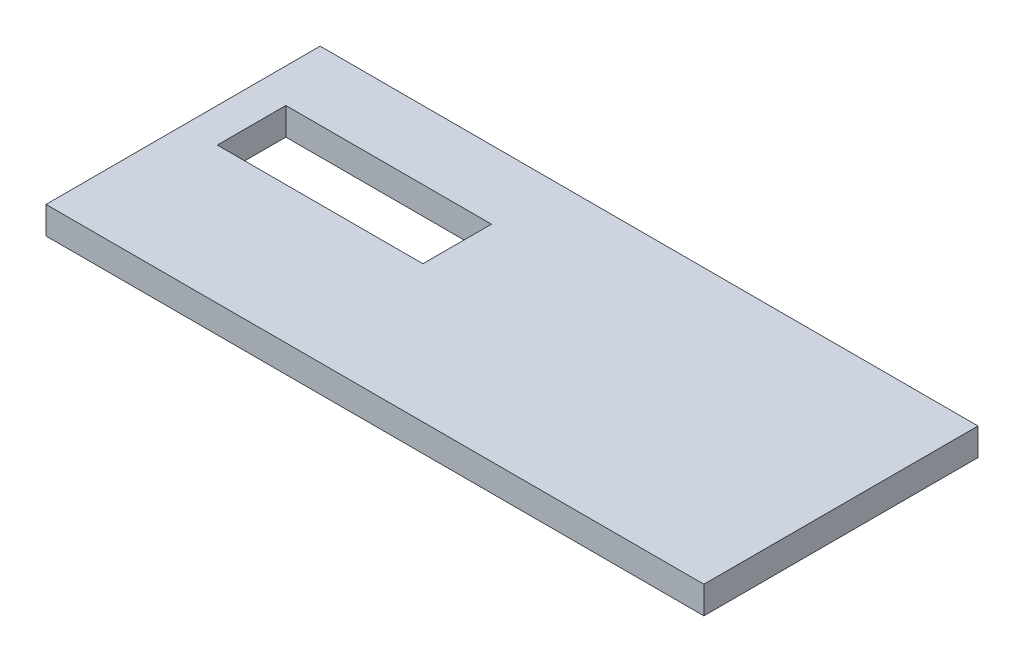
ISO-10303-21;
HEADER;
FILE_DESCRIPTION(('STEP AP214'),'2;1');
FILE_NAME('part.step','',(''),(''),'','','');
FILE_SCHEMA(('AUTOMOTIVE_DESIGN { 1 0 10303 214 1 1 1 1 }'));
ENDSEC;
DATA;
#1=APPLICATION_CONTEXT('core data for automotive mechanical design processes');
#2=APPLICATION_PROTOCOL_DEFINITION('international standard','automotive_design',2000,#1);
#3=PRODUCT_CONTEXT('',#1,'mechanical');
#4=PRODUCT('Part','Part','',(#3));
#5=PRODUCT_RELATED_PRODUCT_CATEGORY('part','',(#4));
#6=PRODUCT_DEFINITION_FORMATION('','',#4);
#7=PRODUCT_DEFINITION_CONTEXT('part definition',#1,'design');
#8=PRODUCT_DEFINITION('design','',#6,#7);
#9=PRODUCT_DEFINITION_SHAPE('','',#8);
#10=(LENGTH_UNIT() NAMED_UNIT(*) SI_UNIT(.MILLI.,.METRE.));
#11=(NAMED_UNIT(*) PLANE_ANGLE_UNIT() SI_UNIT($,.RADIAN.));
#12=(NAMED_UNIT(*) SI_UNIT($,.STERADIAN.) SOLID_ANGLE_UNIT());
#13=UNCERTAINTY_MEASURE_WITH_UNIT(LENGTH_MEASURE(1.E-05),#10,'distance_accuracy_value','');
#14=(GEOMETRIC_REPRESENTATION_CONTEXT(3) GLOBAL_UNCERTAINTY_ASSIGNED_CONTEXT((#13)) GLOBAL_UNIT_ASSIGNED_CONTEXT((#10,
#11,#12)) REPRESENTATION_CONTEXT('',''));
#15=CARTESIAN_POINT('',(0.,0.,0.));
#16=DIRECTION('',(0.,0.,1.));
#17=DIRECTION('',(1.,0.,0.));
#18=AXIS2_PLACEMENT_3D('',#15,#16,#17);
#19=CARTESIAN_POINT('',(0.,4.,0.));
#20=DIRECTION('',(0.,1.,0.));
#21=DIRECTION('',(0.,0.,1.));
#22=AXIS2_PLACEMENT_3D('',#19,#20,#21);
#23=PLANE('',#22);
#24=DIRECTION('',(0.,0.,1.));
#25=VECTOR('',#24,1.);
#26=CARTESIAN_POINT('',(0.,4.,0.));
#27=LINE('',#26,#25);
#28=CARTESIAN_POINT('',(0.,4.,0.));
#29=VERTEX_POINT('',#28);
#30=CARTESIAN_POINT('',(0.,4.,40.));
#31=VERTEX_POINT('',#30);
#32=EDGE_CURVE('E138',#29,#31,#27,.T.);
#33=ORIENTED_EDGE('',*,*,#32,.T.);
#34=DIRECTION('',(1.,0.,0.));
#35=VECTOR('',#34,1.);
#36=CARTESIAN_POINT('',(0.,4.,40.));
#37=LINE('',#36,#35);
#38=CARTESIAN_POINT('',(96.,4.,40.));
#39=VERTEX_POINT('',#38);
#40=EDGE_CURVE('E141',#31,#39,#37,.T.);
#41=ORIENTED_EDGE('',*,*,#40,.T.);
#42=DIRECTION('',(0.,0.,-1.));
#43=VECTOR('',#42,1.);
#44=CARTESIAN_POINT('',(96.,4.,0.));
#45=LINE('',#44,#43);
#46=CARTESIAN_POINT('',(96.,4.,0.));
#47=VERTEX_POINT('',#46);
#48=EDGE_CURVE('E144',#39,#47,#45,.T.);
#49=ORIENTED_EDGE('',*,*,#48,.T.);
#50=DIRECTION('',(-1.,0.,0.));
#51=VECTOR('',#50,1.);
#52=CARTESIAN_POINT('',(0.,4.,0.));
#53=LINE('',#52,#51);
#54=EDGE_CURVE('E146',#47,#29,#53,.T.);
#55=ORIENTED_EDGE('',*,*,#54,.T.);
#56=EDGE_LOOP('',(#33,#41,#49,#55));
#57=FACE_BOUND('',#56,.T.);
#58=DIRECTION('',(1.,0.,0.));
#59=VECTOR('',#58,1.);
#60=CARTESIAN_POINT('',(5.,4.,20.));
#61=LINE('',#60,#59);
#62=CARTESIAN_POINT('',(5.,4.,20.));
#63=VERTEX_POINT('',#62);
#64=CARTESIAN_POINT('',(35.,4.,20.));
#65=VERTEX_POINT('',#64);
#66=EDGE_CURVE('E110',#63,#65,#61,.T.);
#67=ORIENTED_EDGE('',*,*,#66,.F.);
#68=DIRECTION('',(0.,0.,1.));
#69=VECTOR('',#68,1.);
#70=CARTESIAN_POINT('',(5.,4.,10.));
#71=LINE('',#70,#69);
#72=CARTESIAN_POINT('',(5.,4.,10.));
#73=VERTEX_POINT('',#72);
#74=EDGE_CURVE('E102',#73,#63,#71,.T.);
#75=ORIENTED_EDGE('',*,*,#74,.F.);
#76=DIRECTION('',(-1.,0.,0.));
#77=VECTOR('',#76,1.);
#78=CARTESIAN_POINT('',(5.,4.,10.));
#79=LINE('',#78,#77);
#80=CARTESIAN_POINT('',(35.,4.,10.));
#81=VERTEX_POINT('',#80);
#82=EDGE_CURVE('E124',#81,#73,#79,.T.);
#83=ORIENTED_EDGE('',*,*,#82,.F.);
#84=DIRECTION('',(0.,0.,-1.));
#85=VECTOR('',#84,1.);
#86=CARTESIAN_POINT('',(35.,4.,10.));
#87=LINE('',#86,#85);
#88=EDGE_CURVE('E122',#65,#81,#87,.T.);
#89=ORIENTED_EDGE('',*,*,#88,.F.);
#90=EDGE_LOOP('',(#67,#75,#83,#89));
#91=FACE_BOUND('',#90,.T.);
#92=ADVANCED_FACE('F37',(#57,#91),#23,.T.);
#93=CARTESIAN_POINT('',(0.,0.,0.));
#94=DIRECTION('',(0.,1.,0.));
#95=DIRECTION('',(0.,0.,1.));
#96=AXIS2_PLACEMENT_3D('',#93,#94,#95);
#97=PLANE('',#96);
#98=DIRECTION('',(0.,0.,1.));
#99=VECTOR('',#98,1.);
#100=CARTESIAN_POINT('',(0.,0.,0.));
#101=LINE('',#100,#99);
#102=CARTESIAN_POINT('',(0.,0.,0.));
#103=VERTEX_POINT('',#102);
#104=CARTESIAN_POINT('',(0.,0.,40.));
#105=VERTEX_POINT('',#104);
#106=EDGE_CURVE('E118',#103,#105,#101,.T.);
#107=ORIENTED_EDGE('',*,*,#106,.F.);
#108=DIRECTION('',(-1.,0.,0.));
#109=VECTOR('',#108,1.);
#110=CARTESIAN_POINT('',(0.,0.,0.));
#111=LINE('',#110,#109);
#112=CARTESIAN_POINT('',(96.,0.,0.));
#113=VERTEX_POINT('',#112);
#114=EDGE_CURVE('E142',#113,#103,#111,.T.);
#115=ORIENTED_EDGE('',*,*,#114,.F.);
#116=DIRECTION('',(0.,0.,-1.));
#117=VECTOR('',#116,1.);
#118=CARTESIAN_POINT('',(96.,0.,0.));
#119=LINE('',#118,#117);
#120=CARTESIAN_POINT('',(96.,0.,40.));
#121=VERTEX_POINT('',#120);
#122=EDGE_CURVE('E153',#121,#113,#119,.T.);
#123=ORIENTED_EDGE('',*,*,#122,.F.);
#124=DIRECTION('',(1.,0.,0.));
#125=VECTOR('',#124,1.);
#126=CARTESIAN_POINT('',(0.,0.,40.));
#127=LINE('',#126,#125);
#128=EDGE_CURVE('E151',#105,#121,#127,.T.);
#129=ORIENTED_EDGE('',*,*,#128,.F.);
#130=EDGE_LOOP('',(#107,#115,#123,#129));
#131=FACE_BOUND('',#130,.T.);
#132=DIRECTION('',(0.,0.,1.));
#133=VECTOR('',#132,1.);
#134=CARTESIAN_POINT('',(5.,0.,10.));
#135=LINE('',#134,#133);
#136=CARTESIAN_POINT('',(5.,0.,10.));
#137=VERTEX_POINT('',#136);
#138=CARTESIAN_POINT('',(5.,0.,20.));
#139=VERTEX_POINT('',#138);
#140=EDGE_CURVE('E60',#137,#139,#135,.T.);
#141=ORIENTED_EDGE('',*,*,#140,.T.);
#142=DIRECTION('',(1.,0.,0.));
#143=VECTOR('',#142,1.);
#144=CARTESIAN_POINT('',(5.,0.,20.));
#145=LINE('',#144,#143);
#146=CARTESIAN_POINT('',(35.,0.,20.));
#147=VERTEX_POINT('',#146);
#148=EDGE_CURVE('E117',#139,#147,#145,.T.);
#149=ORIENTED_EDGE('',*,*,#148,.T.);
#150=DIRECTION('',(0.,0.,-1.));
#151=VECTOR('',#150,1.);
#152=CARTESIAN_POINT('',(35.,0.,10.));
#153=LINE('',#152,#151);
#154=CARTESIAN_POINT('',(35.,0.,10.));
#155=VERTEX_POINT('',#154);
#156=EDGE_CURVE('E130',#147,#155,#153,.T.);
#157=ORIENTED_EDGE('',*,*,#156,.T.);
#158=DIRECTION('',(-1.,0.,0.));
#159=VECTOR('',#158,1.);
#160=CARTESIAN_POINT('',(5.,0.,10.));
#161=LINE('',#160,#159);
#162=EDGE_CURVE('E111',#155,#137,#161,.T.);
#163=ORIENTED_EDGE('',*,*,#162,.T.);
#164=EDGE_LOOP('',(#141,#149,#157,#163));
#165=FACE_BOUND('',#164,.T.);
#166=ADVANCED_FACE('F171',(#131,#165),#97,.F.);
#167=CARTESIAN_POINT('',(0.,4.,0.));
#168=DIRECTION('',(1.,0.,0.));
#169=DIRECTION('',(0.,0.,-1.));
#170=AXIS2_PLACEMENT_3D('',#167,#168,#169);
#171=PLANE('',#170);
#172=ORIENTED_EDGE('',*,*,#106,.T.);
#173=DIRECTION('',(0.,-1.,0.));
#174=VECTOR('',#173,1.);
#175=CARTESIAN_POINT('',(0.,4.,40.));
#176=LINE('',#175,#174);
#177=EDGE_CURVE('E11',#31,#105,#176,.T.);
#178=ORIENTED_EDGE('',*,*,#177,.F.);
#179=ORIENTED_EDGE('',*,*,#32,.F.);
#180=DIRECTION('',(0.,-1.,0.));
#181=VECTOR('',#180,1.);
#182=CARTESIAN_POINT('',(0.,4.,0.));
#183=LINE('',#182,#181);
#184=EDGE_CURVE('E148',#29,#103,#183,.T.);
#185=ORIENTED_EDGE('',*,*,#184,.T.);
#186=EDGE_LOOP('',(#172,#178,#179,#185));
#187=FACE_BOUND('',#186,.T.);
#188=ADVANCED_FACE('F39',(#187),#171,.F.);
#189=CARTESIAN_POINT('',(0.,4.,40.));
#190=DIRECTION('',(0.,0.,-1.));
#191=DIRECTION('',(-1.,0.,0.));
#192=AXIS2_PLACEMENT_3D('',#189,#190,#191);
#193=PLANE('',#192);
#194=ORIENTED_EDGE('',*,*,#128,.T.);
#195=DIRECTION('',(0.,-1.,0.));
#196=VECTOR('',#195,1.);
#197=CARTESIAN_POINT('',(96.,4.,40.));
#198=LINE('',#197,#196);
#199=EDGE_CURVE('E45',#39,#121,#198,.T.);
#200=ORIENTED_EDGE('',*,*,#199,.F.);
#201=ORIENTED_EDGE('',*,*,#40,.F.);
#202=ORIENTED_EDGE('',*,*,#177,.T.);
#203=EDGE_LOOP('',(#194,#200,#201,#202));
#204=FACE_BOUND('',#203,.T.);
#205=ADVANCED_FACE('F181',(#204),#193,.F.);
#206=CARTESIAN_POINT('',(96.,4.,0.));
#207=DIRECTION('',(-1.,0.,0.));
#208=DIRECTION('',(0.,0.,1.));
#209=AXIS2_PLACEMENT_3D('',#206,#207,#208);
#210=PLANE('',#209);
#211=ORIENTED_EDGE('',*,*,#122,.T.);
#212=DIRECTION('',(0.,-1.,0.));
#213=VECTOR('',#212,1.);
#214=CARTESIAN_POINT('',(96.,4.,0.));
#215=LINE('',#214,#213);
#216=EDGE_CURVE('E158',#47,#113,#215,.T.);
#217=ORIENTED_EDGE('',*,*,#216,.F.);
#218=ORIENTED_EDGE('',*,*,#48,.F.);
#219=ORIENTED_EDGE('',*,*,#199,.T.);
#220=EDGE_LOOP('',(#211,#217,#218,#219));
#221=FACE_BOUND('',#220,.T.);
#222=ADVANCED_FACE('F165',(#221),#210,.F.);
#223=CARTESIAN_POINT('',(0.,4.,0.));
#224=DIRECTION('',(0.,0.,1.));
#225=DIRECTION('',(1.,0.,0.));
#226=AXIS2_PLACEMENT_3D('',#223,#224,#225);
#227=PLANE('',#226);
#228=ORIENTED_EDGE('',*,*,#114,.T.);
#229=ORIENTED_EDGE('',*,*,#184,.F.);
#230=ORIENTED_EDGE('',*,*,#54,.F.);
#231=ORIENTED_EDGE('',*,*,#216,.T.);
#232=EDGE_LOOP('',(#228,#229,#230,#231));
#233=FACE_BOUND('',#232,.T.);
#234=ADVANCED_FACE('F175',(#233),#227,.F.);
#235=CARTESIAN_POINT('',(5.,4.,10.));
#236=DIRECTION('',(1.,0.,0.));
#237=DIRECTION('',(0.,0.,-1.));
#238=AXIS2_PLACEMENT_3D('',#235,#236,#237);
#239=PLANE('',#238);
#240=ORIENTED_EDGE('',*,*,#140,.F.);
#241=DIRECTION('',(0.,-1.,0.));
#242=VECTOR('',#241,1.);
#243=CARTESIAN_POINT('',(5.,4.,10.));
#244=LINE('',#243,#242);
#245=EDGE_CURVE('E106',#73,#137,#244,.T.);
#246=ORIENTED_EDGE('',*,*,#245,.F.);
#247=ORIENTED_EDGE('',*,*,#74,.T.);
#248=DIRECTION('',(0.,-1.,0.));
#249=VECTOR('',#248,1.);
#250=CARTESIAN_POINT('',(5.,4.,20.));
#251=LINE('',#250,#249);
#252=EDGE_CURVE('E105',#63,#139,#251,.T.);
#253=ORIENTED_EDGE('',*,*,#252,.T.);
#254=EDGE_LOOP('',(#240,#246,#247,#253));
#255=FACE_BOUND('',#254,.T.);
#256=ADVANCED_FACE('F104',(#255),#239,.T.);
#257=CARTESIAN_POINT('',(5.,4.,20.));
#258=DIRECTION('',(0.,0.,-1.));
#259=DIRECTION('',(-1.,0.,0.));
#260=AXIS2_PLACEMENT_3D('',#257,#258,#259);
#261=PLANE('',#260);
#262=ORIENTED_EDGE('',*,*,#148,.F.);
#263=ORIENTED_EDGE('',*,*,#252,.F.);
#264=ORIENTED_EDGE('',*,*,#66,.T.);
#265=DIRECTION('',(0.,-1.,0.));
#266=VECTOR('',#265,1.);
#267=CARTESIAN_POINT('',(35.,4.,20.));
#268=LINE('',#267,#266);
#269=EDGE_CURVE('E119',#65,#147,#268,.T.);
#270=ORIENTED_EDGE('',*,*,#269,.T.);
#271=EDGE_LOOP('',(#262,#263,#264,#270));
#272=FACE_BOUND('',#271,.T.);
#273=ADVANCED_FACE('F114',(#272),#261,.T.);
#274=CARTESIAN_POINT('',(35.,4.,10.));
#275=DIRECTION('',(-1.,0.,0.));
#276=DIRECTION('',(0.,0.,1.));
#277=AXIS2_PLACEMENT_3D('',#274,#275,#276);
#278=PLANE('',#277);
#279=ORIENTED_EDGE('',*,*,#156,.F.);
#280=ORIENTED_EDGE('',*,*,#269,.F.);
#281=ORIENTED_EDGE('',*,*,#88,.T.);
#282=DIRECTION('',(0.,-1.,0.));
#283=VECTOR('',#282,1.);
#284=CARTESIAN_POINT('',(35.,4.,10.));
#285=LINE('',#284,#283);
#286=EDGE_CURVE('E52',#81,#155,#285,.T.);
#287=ORIENTED_EDGE('',*,*,#286,.T.);
#288=EDGE_LOOP('',(#279,#280,#281,#287));
#289=FACE_BOUND('',#288,.T.);
#290=ADVANCED_FACE('F204',(#289),#278,.T.);
#291=CARTESIAN_POINT('',(5.,4.,10.));
#292=DIRECTION('',(0.,0.,1.));
#293=DIRECTION('',(1.,0.,0.));
#294=AXIS2_PLACEMENT_3D('',#291,#292,#293);
#295=PLANE('',#294);
#296=ORIENTED_EDGE('',*,*,#162,.F.);
#297=ORIENTED_EDGE('',*,*,#286,.F.);
#298=ORIENTED_EDGE('',*,*,#82,.T.);
#299=ORIENTED_EDGE('',*,*,#245,.T.);
#300=EDGE_LOOP('',(#296,#297,#298,#299));
#301=FACE_BOUND('',#300,.T.);
#302=ADVANCED_FACE('F208',(#301),#295,.T.);
#303=CLOSED_SHELL('',(#92,#166,#188,#205,#222,#234,#256,#273,#290,#302));
#304=MANIFOLD_SOLID_BREP('B2',#303);
#305=ADVANCED_BREP_SHAPE_REPRESENTATION('',(#18,#304),#14);
#306=SHAPE_DEFINITION_REPRESENTATION(#9,#305);
ENDSEC;
END-ISO-10303-21;
